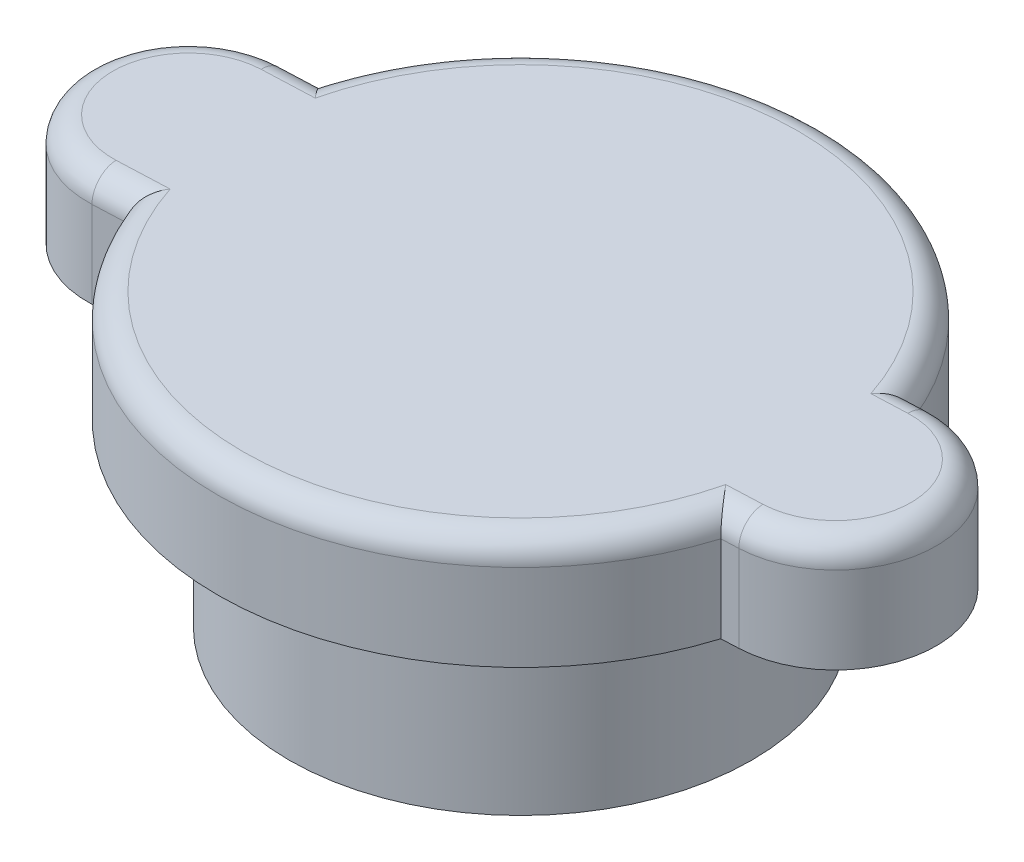
ISO-10303-21;
HEADER;
FILE_DESCRIPTION(('STEP AP214'),'2;1');
FILE_NAME('part.step','',(''),(''),'','','');
FILE_SCHEMA(('AUTOMOTIVE_DESIGN { 1 0 10303 214 1 1 1 1 }'));
ENDSEC;
DATA;
#1=APPLICATION_CONTEXT('core data for automotive mechanical design processes');
#2=APPLICATION_PROTOCOL_DEFINITION('international standard','automotive_design',2000,#1);
#3=PRODUCT_CONTEXT('',#1,'mechanical');
#4=PRODUCT('Part','Part','',(#3));
#5=PRODUCT_RELATED_PRODUCT_CATEGORY('part','',(#4));
#6=PRODUCT_DEFINITION_FORMATION('','',#4);
#7=PRODUCT_DEFINITION_CONTEXT('part definition',#1,'design');
#8=PRODUCT_DEFINITION('design','',#6,#7);
#9=PRODUCT_DEFINITION_SHAPE('','',#8);
#10=(LENGTH_UNIT() NAMED_UNIT(*) SI_UNIT(.MILLI.,.METRE.));
#11=(NAMED_UNIT(*) PLANE_ANGLE_UNIT() SI_UNIT($,.RADIAN.));
#12=(NAMED_UNIT(*) SI_UNIT($,.STERADIAN.) SOLID_ANGLE_UNIT());
#13=UNCERTAINTY_MEASURE_WITH_UNIT(LENGTH_MEASURE(1.E-05),#10,'distance_accuracy_value','');
#14=(GEOMETRIC_REPRESENTATION_CONTEXT(3) GLOBAL_UNCERTAINTY_ASSIGNED_CONTEXT((#13)) GLOBAL_UNIT_ASSIGNED_CONTEXT((#10,
#11,#12)) REPRESENTATION_CONTEXT('',''));
#15=CARTESIAN_POINT('',(0.,0.,0.));
#16=DIRECTION('',(0.,0.,1.));
#17=DIRECTION('',(1.,0.,0.));
#18=AXIS2_PLACEMENT_3D('',#15,#16,#17);
#19=CARTESIAN_POINT('',(0.,14.224,0.));
#20=DIRECTION('',(0.,-1.,0.));
#21=DIRECTION('',(0.,0.,-1.));
#22=AXIS2_PLACEMENT_3D('',#19,#20,#21);
#23=CYLINDRICAL_SURFACE('',#22,18.415);
#24=CARTESIAN_POINT('',(0.,14.224,0.));
#25=DIRECTION('',(0.,1.,0.));
#26=DIRECTION('',(0.,0.,1.));
#27=AXIS2_PLACEMENT_3D('',#24,#25,#26);
#28=CIRCLE('',#27,18.415);
#29=CARTESIAN_POINT('',(0.,14.224,18.415));
#30=VERTEX_POINT('',#29);
#31=EDGE_CURVE('E219',#30,#30,#28,.T.);
#32=ORIENTED_EDGE('',*,*,#31,.F.);
#33=EDGE_LOOP('',(#32));
#34=FACE_BOUND('',#33,.T.);
#35=CARTESIAN_POINT('',(0.,0.,0.));
#36=DIRECTION('',(0.,1.,0.));
#37=DIRECTION('',(0.,0.,1.));
#38=AXIS2_PLACEMENT_3D('',#35,#36,#37);
#39=CIRCLE('',#38,18.415);
#40=CARTESIAN_POINT('',(0.,0.,18.415));
#41=VERTEX_POINT('',#40);
#42=EDGE_CURVE('E163',#41,#41,#39,.T.);
#43=ORIENTED_EDGE('',*,*,#42,.T.);
#44=EDGE_LOOP('',(#43));
#45=FACE_BOUND('',#44,.T.);
#46=ADVANCED_FACE('F60',(#34,#45),#23,.T.);
#47=CARTESIAN_POINT('',(0.,0.,0.));
#48=DIRECTION('',(0.,1.,0.));
#49=DIRECTION('',(0.,0.,1.));
#50=AXIS2_PLACEMENT_3D('',#47,#48,#49);
#51=PLANE('',#50);
#52=ORIENTED_EDGE('',*,*,#42,.F.);
#53=EDGE_LOOP('',(#52));
#54=FACE_BOUND('',#53,.T.);
#55=ADVANCED_FACE('F393',(#54),#51,.F.);
#56=CARTESIAN_POINT('',(0.,23.114,0.));
#57=DIRECTION('',(0.,-1.,0.));
#58=DIRECTION('',(0.,0.,-1.));
#59=AXIS2_PLACEMENT_3D('',#56,#57,#58);
#60=CYLINDRICAL_SURFACE('',#59,24.0985030733377);
#61=DIRECTION('',(0.,-1.,0.));
#62=VECTOR('',#61,1.);
#63=CARTESIAN_POINT('',(-23.0324921981435,23.114,-7.08816996961317));
#64=LINE('',#63,#62);
#65=CARTESIAN_POINT('',(-23.0324921981435,14.224,-7.08816996961317));
#66=VERTEX_POINT('',#65);
#67=CARTESIAN_POINT('',(-23.0324921981435,21.114,-7.08816996961317));
#68=VERTEX_POINT('',#67);
#69=EDGE_CURVE('E189',#66,#68,#64,.F.);
#70=ORIENTED_EDGE('',*,*,#69,.T.);
#71=CARTESIAN_POINT('',(0.,21.114,0.));
#72=DIRECTION('',(0.,1.,0.));
#73=DIRECTION('',(0.,0.,1.));
#74=AXIS2_PLACEMENT_3D('',#71,#72,#73);
#75=CIRCLE('',#74,24.0985030733377);
#76=CARTESIAN_POINT('',(22.3744741533916,21.114,-8.95101987121461));
#77=VERTEX_POINT('',#76);
#78=EDGE_CURVE('E12',#68,#77,#75,.F.);
#79=ORIENTED_EDGE('',*,*,#78,.T.);
#80=DIRECTION('',(0.,-1.,0.));
#81=VECTOR('',#80,1.);
#82=CARTESIAN_POINT('',(22.3744741533916,23.114,-8.95101987121461));
#83=LINE('',#82,#81);
#84=CARTESIAN_POINT('',(22.3744741533916,14.224,-8.95101987121461));
#85=VERTEX_POINT('',#84);
#86=EDGE_CURVE('E214',#77,#85,#83,.T.);
#87=ORIENTED_EDGE('',*,*,#86,.T.);
#88=CARTESIAN_POINT('',(0.,14.224,0.));
#89=DIRECTION('',(0.,1.,0.));
#90=DIRECTION('',(0.,0.,1.));
#91=AXIS2_PLACEMENT_3D('',#88,#89,#90);
#92=CIRCLE('',#91,24.0985030733377);
#93=EDGE_CURVE('E183',#85,#66,#92,.T.);
#94=ORIENTED_EDGE('',*,*,#93,.T.);
#95=EDGE_LOOP('',(#70,#79,#87,#94));
#96=FACE_BOUND('',#95,.T.);
#97=ADVANCED_FACE('F369',(#96),#60,.T.);
#98=CARTESIAN_POINT('',(0.,14.224,0.));
#99=DIRECTION('',(0.,1.,0.));
#100=DIRECTION('',(0.,0.,1.));
#101=AXIS2_PLACEMENT_3D('',#98,#99,#100);
#102=PLANE('',#101);
#103=ORIENTED_EDGE('',*,*,#31,.T.);
#104=EDGE_LOOP('',(#103));
#105=FACE_BOUND('',#104,.T.);
#106=ORIENTED_EDGE('',*,*,#93,.F.);
#107=DIRECTION('',(0.999159509215093,0.,-0.0409911593524141));
#108=VECTOR('',#107,1.);
#109=CARTESIAN_POINT('',(-25.7076605564393,14.224,-6.97841947286257));
#110=LINE('',#109,#108);
#111=CARTESIAN_POINT('',(23.7492394811986,14.224,-9.00742050004771));
#112=VERTEX_POINT('',#111);
#113=EDGE_CURVE('E199',#85,#112,#110,.T.);
#114=ORIENTED_EDGE('',*,*,#113,.T.);
#115=CARTESIAN_POINT('',(24.0782485035745,14.224,-0.987825579633825));
#116=DIRECTION('',(0.,1.,0.));
#117=DIRECTION('',(0.,0.,1.));
#118=AXIS2_PLACEMENT_3D('',#115,#116,#117);
#119=CIRCLE('',#118,8.02634098604919);
#120=CARTESIAN_POINT('',(24.4072575259505,14.224,7.03176934078006));
#121=VERTEX_POINT('',#120);
#122=EDGE_CURVE('E174',#121,#112,#119,.T.);
#123=ORIENTED_EDGE('',*,*,#122,.F.);
#124=DIRECTION('',(0.999159509215093,0.,-0.0409911593524139));
#125=VECTOR('',#124,1.);
#126=CARTESIAN_POINT('',(-25.0496425116874,14.224,9.0607703679652));
#127=LINE('',#126,#125);
#128=CARTESIAN_POINT('',(23.0324921981435,14.224,7.08816996961317));
#129=VERTEX_POINT('',#128);
#130=EDGE_CURVE('E155',#129,#121,#127,.T.);
#131=ORIENTED_EDGE('',*,*,#130,.F.);
#132=CARTESIAN_POINT('',(-22.3744741533916,14.224,8.95101987121461));
#133=VERTEX_POINT('',#132);
#134=EDGE_CURVE('E171',#133,#129,#92,.T.);
#135=ORIENTED_EDGE('',*,*,#134,.F.);
#136=CARTESIAN_POINT('',(-25.0496425116874,14.224,9.0607703679652));
#137=VERTEX_POINT('',#136);
#138=EDGE_CURVE('E176',#137,#133,#127,.T.);
#139=ORIENTED_EDGE('',*,*,#138,.F.);
#140=CARTESIAN_POINT('',(-25.3786515340634,14.224,1.04117544755132));
#141=DIRECTION('',(0.,1.,0.));
#142=DIRECTION('',(0.,0.,1.));
#143=AXIS2_PLACEMENT_3D('',#140,#141,#142);
#144=CIRCLE('',#143,8.02634098604918);
#145=CARTESIAN_POINT('',(-25.7076605564393,14.224,-6.97841947286257));
#146=VERTEX_POINT('',#145);
#147=EDGE_CURVE('E177',#146,#137,#144,.T.);
#148=ORIENTED_EDGE('',*,*,#147,.F.);
#149=EDGE_CURVE('E200',#146,#66,#110,.T.);
#150=ORIENTED_EDGE('',*,*,#149,.T.);
#151=EDGE_LOOP('',(#106,#114,#123,#131,#135,#139,#148,#150));
#152=FACE_BOUND('',#151,.T.);
#153=ADVANCED_FACE('F169',(#105,#152),#102,.F.);
#154=CARTESIAN_POINT('',(0.,23.114,0.));
#155=DIRECTION('',(0.,1.,0.));
#156=DIRECTION('',(0.,0.,1.));
#157=AXIS2_PLACEMENT_3D('',#154,#155,#156);
#158=PLANE('',#157);
#159=CARTESIAN_POINT('',(24.0782485035745,23.114,-0.987825579633825));
#160=DIRECTION('',(0.,1.,0.));
#161=DIRECTION('',(0.,0.,1.));
#162=AXIS2_PLACEMENT_3D('',#159,#160,#161);
#163=CIRCLE('',#162,6.02634098604919);
#164=CARTESIAN_POINT('',(24.3252752072456,23.114,5.03345032234988));
#165=VERTEX_POINT('',#164);
#166=CARTESIAN_POINT('',(23.8312217999034,23.114,-7.00910148161753));
#167=VERTEX_POINT('',#166);
#168=EDGE_CURVE('E248',#165,#167,#163,.T.);
#169=ORIENTED_EDGE('',*,*,#168,.T.);
#170=DIRECTION('',(0.999159509215093,0.,-0.0409911593524141));
#171=VECTOR('',#170,1.);
#172=CARTESIAN_POINT('',(-0.247026703671126,23.114,-6.0212759019837));
#173=LINE('',#172,#171);
#174=CARTESIAN_POINT('',(20.9960315173369,23.114,-6.89278598284556));
#175=VERTEX_POINT('',#174);
#176=EDGE_CURVE('E251',#167,#175,#173,.F.);
#177=ORIENTED_EDGE('',*,*,#176,.T.);
#178=CARTESIAN_POINT('',(0.,23.114,0.));
#179=DIRECTION('',(0.,1.,0.));
#180=DIRECTION('',(0.,0.,1.));
#181=AXIS2_PLACEMENT_3D('',#178,#179,#180);
#182=CIRCLE('',#181,22.0985030733377);
#183=CARTESIAN_POINT('',(-21.4900849246791,23.114,-5.14976582112183));
#184=VERTEX_POINT('',#183);
#185=EDGE_CURVE('E230',#175,#184,#182,.T.);
#186=ORIENTED_EDGE('',*,*,#185,.T.);
#187=DIRECTION('',(0.999159509215093,0.,-0.0409911593524141));
#188=VECTOR('',#187,1.);
#189=CARTESIAN_POINT('',(-0.247026703671126,23.114,-6.0212759019837));
#190=LINE('',#189,#188);
#191=CARTESIAN_POINT('',(-25.6256782377345,23.114,-4.98010045443238));
#192=VERTEX_POINT('',#191);
#193=EDGE_CURVE('E233',#184,#192,#190,.F.);
#194=ORIENTED_EDGE('',*,*,#193,.T.);
#195=CARTESIAN_POINT('',(-25.3786515340634,23.114,1.04117544755132));
#196=DIRECTION('',(0.,1.,0.));
#197=DIRECTION('',(0.,0.,1.));
#198=AXIS2_PLACEMENT_3D('',#195,#196,#197);
#199=CIRCLE('',#198,6.02634098604918);
#200=CARTESIAN_POINT('',(-25.1316248303922,23.114,7.06245134953502));
#201=VERTEX_POINT('',#200);
#202=EDGE_CURVE('E236',#192,#201,#199,.T.);
#203=ORIENTED_EDGE('',*,*,#202,.T.);
#204=DIRECTION('',(0.999159509215093,0.,-0.0409911593524139));
#205=VECTOR('',#204,1.);
#206=CARTESIAN_POINT('',(-22.4564564720964,23.114,6.95270085278442));
#207=LINE('',#206,#205);
#208=CARTESIAN_POINT('',(-20.9960315173369,23.114,6.89278598284557));
#209=VERTEX_POINT('',#208);
#210=EDGE_CURVE('E239',#201,#209,#207,.T.);
#211=ORIENTED_EDGE('',*,*,#210,.T.);
#212=CARTESIAN_POINT('',(0.,23.114,0.));
#213=DIRECTION('',(0.,1.,0.));
#214=DIRECTION('',(0.,0.,1.));
#215=AXIS2_PLACEMENT_3D('',#212,#213,#214);
#216=CIRCLE('',#215,22.0985030733377);
#217=CARTESIAN_POINT('',(21.4900849246791,23.114,5.14976582112183));
#218=VERTEX_POINT('',#217);
#219=EDGE_CURVE('E242',#209,#218,#216,.T.);
#220=ORIENTED_EDGE('',*,*,#219,.T.);
#221=DIRECTION('',(0.999159509215093,0.,-0.0409911593524139));
#222=VECTOR('',#221,1.);
#223=CARTESIAN_POINT('',(24.3252752072456,23.114,5.03345032234988));
#224=LINE('',#223,#222);
#225=EDGE_CURVE('E245',#218,#165,#224,.T.);
#226=ORIENTED_EDGE('',*,*,#225,.T.);
#227=EDGE_LOOP('',(#169,#177,#186,#194,#203,#211,#220,#226));
#228=FACE_BOUND('',#227,.T.);
#229=ADVANCED_FACE('F349',(#228),#158,.T.);
#230=DIRECTION('',(0.,-1.,0.));
#231=VECTOR('',#230,1.);
#232=CARTESIAN_POINT('',(23.0324921981435,23.114,7.08816996961317));
#233=LINE('',#232,#231);
#234=CARTESIAN_POINT('',(23.0324921981435,21.114,7.08816996961317));
#235=VERTEX_POINT('',#234);
#236=EDGE_CURVE('E151',#235,#129,#233,.T.);
#237=ORIENTED_EDGE('',*,*,#236,.F.);
#238=CARTESIAN_POINT('',(0.,21.114,0.));
#239=DIRECTION('',(0.,1.,0.));
#240=DIRECTION('',(0.,0.,1.));
#241=AXIS2_PLACEMENT_3D('',#238,#239,#240);
#242=CIRCLE('',#241,24.0985030733377);
#243=CARTESIAN_POINT('',(-22.3744741533916,21.114,8.9510198712146));
#244=VERTEX_POINT('',#243);
#245=EDGE_CURVE('E260',#235,#244,#242,.F.);
#246=ORIENTED_EDGE('',*,*,#245,.T.);
#247=DIRECTION('',(0.,-1.,0.));
#248=VECTOR('',#247,1.);
#249=CARTESIAN_POINT('',(-22.3744741533916,23.114,8.9510198712146));
#250=LINE('',#249,#248);
#251=EDGE_CURVE('E164',#133,#244,#250,.F.);
#252=ORIENTED_EDGE('',*,*,#251,.F.);
#253=ORIENTED_EDGE('',*,*,#134,.T.);
#254=EDGE_LOOP('',(#237,#246,#252,#253));
#255=FACE_BOUND('',#254,.T.);
#256=ADVANCED_FACE('F179',(#255),#60,.T.);
#257=CARTESIAN_POINT('',(-25.3786515340634,23.114,1.04117544755132));
#258=DIRECTION('',(0.,-1.,0.));
#259=DIRECTION('',(0.,0.,-1.));
#260=AXIS2_PLACEMENT_3D('',#257,#258,#259);
#261=CYLINDRICAL_SURFACE('',#260,8.02634098604918);
#262=DIRECTION('',(0.,-1.,0.));
#263=VECTOR('',#262,1.);
#264=CARTESIAN_POINT('',(-25.0496425116874,23.114,9.0607703679652));
#265=LINE('',#264,#263);
#266=CARTESIAN_POINT('',(-25.0496425116874,21.114,9.0607703679652));
#267=VERTEX_POINT('',#266);
#268=EDGE_CURVE('E184',#267,#137,#265,.T.);
#269=ORIENTED_EDGE('',*,*,#268,.F.);
#270=CARTESIAN_POINT('',(-25.3786515340634,21.114,1.04117544755132));
#271=DIRECTION('',(0.,1.,0.));
#272=DIRECTION('',(0.,0.,1.));
#273=AXIS2_PLACEMENT_3D('',#270,#271,#272);
#274=CIRCLE('',#273,8.02634098604918);
#275=CARTESIAN_POINT('',(-25.7076605564393,21.114,-6.97841947286257));
#276=VERTEX_POINT('',#275);
#277=EDGE_CURVE('E85',#267,#276,#274,.F.);
#278=ORIENTED_EDGE('',*,*,#277,.T.);
#279=DIRECTION('',(0.,-1.,0.));
#280=VECTOR('',#279,1.);
#281=CARTESIAN_POINT('',(-25.7076605564393,23.114,-6.97841947286257));
#282=LINE('',#281,#280);
#283=EDGE_CURVE('E204',#276,#146,#282,.T.);
#284=ORIENTED_EDGE('',*,*,#283,.T.);
#285=ORIENTED_EDGE('',*,*,#147,.T.);
#286=EDGE_LOOP('',(#269,#278,#284,#285));
#287=FACE_BOUND('',#286,.T.);
#288=ADVANCED_FACE('F378',(#287),#261,.T.);
#289=CARTESIAN_POINT('',(-25.0496425116874,23.114,9.0607703679652));
#290=DIRECTION('',(-0.0409911593524139,0.,-0.999159509215093));
#291=DIRECTION('',(-0.999159509215093,0.,0.0409911593524139));
#292=AXIS2_PLACEMENT_3D('',#289,#290,#291);
#293=PLANE('',#292);
#294=ORIENTED_EDGE('',*,*,#251,.T.);
#295=DIRECTION('',(0.999159509215093,0.,-0.0409911593524139));
#296=VECTOR('',#295,1.);
#297=CARTESIAN_POINT('',(-25.0496425116874,21.114,9.0607703679652));
#298=LINE('',#297,#296);
#299=EDGE_CURVE('E263',#244,#267,#298,.F.);
#300=ORIENTED_EDGE('',*,*,#299,.T.);
#301=ORIENTED_EDGE('',*,*,#268,.T.);
#302=ORIENTED_EDGE('',*,*,#138,.T.);
#303=EDGE_LOOP('',(#294,#300,#301,#302));
#304=FACE_BOUND('',#303,.T.);
#305=ADVANCED_FACE('F380',(#304),#293,.F.);
#306=CARTESIAN_POINT('',(-25.7076605564393,23.114,-6.97841947286257));
#307=DIRECTION('',(-0.0409911593524141,0.,-0.999159509215093));
#308=DIRECTION('',(-0.999159509215093,0.,0.0409911593524141));
#309=AXIS2_PLACEMENT_3D('',#306,#307,#308);
#310=PLANE('',#309);
#311=ORIENTED_EDGE('',*,*,#283,.F.);
#312=DIRECTION('',(0.999159509215093,0.,-0.0409911593524141));
#313=VECTOR('',#312,1.);
#314=CARTESIAN_POINT('',(-25.7076605564393,21.114,-6.97841947286257));
#315=LINE('',#314,#313);
#316=EDGE_CURVE('E70',#276,#68,#315,.T.);
#317=ORIENTED_EDGE('',*,*,#316,.T.);
#318=ORIENTED_EDGE('',*,*,#69,.F.);
#319=ORIENTED_EDGE('',*,*,#149,.F.);
#320=EDGE_LOOP('',(#311,#317,#318,#319));
#321=FACE_BOUND('',#320,.T.);
#322=ADVANCED_FACE('F377',(#321),#310,.T.);
#323=CARTESIAN_POINT('',(24.0782485035745,23.114,-0.987825579633825));
#324=DIRECTION('',(0.,-1.,0.));
#325=DIRECTION('',(0.,0.,-1.));
#326=AXIS2_PLACEMENT_3D('',#323,#324,#325);
#327=CYLINDRICAL_SURFACE('',#326,8.02634098604919);
#328=DIRECTION('',(0.,-1.,0.));
#329=VECTOR('',#328,1.);
#330=CARTESIAN_POINT('',(23.7492394811986,23.114,-9.00742050004771));
#331=LINE('',#330,#329);
#332=CARTESIAN_POINT('',(23.7492394811986,21.114,-9.00742050004771));
#333=VERTEX_POINT('',#332);
#334=EDGE_CURVE('E207',#333,#112,#331,.T.);
#335=ORIENTED_EDGE('',*,*,#334,.F.);
#336=CARTESIAN_POINT('',(24.0782485035745,21.114,-0.987825579633825));
#337=DIRECTION('',(0.,1.,0.));
#338=DIRECTION('',(0.,0.,1.));
#339=AXIS2_PLACEMENT_3D('',#336,#337,#338);
#340=CIRCLE('',#339,8.02634098604919);
#341=CARTESIAN_POINT('',(24.4072575259505,21.114,7.03176934078006));
#342=VERTEX_POINT('',#341);
#343=EDGE_CURVE('E255',#333,#342,#340,.F.);
#344=ORIENTED_EDGE('',*,*,#343,.T.);
#345=DIRECTION('',(0.,-1.,0.));
#346=VECTOR('',#345,1.);
#347=CARTESIAN_POINT('',(24.4072575259505,23.114,7.03176934078006));
#348=LINE('',#347,#346);
#349=EDGE_CURVE('E190',#342,#121,#348,.T.);
#350=ORIENTED_EDGE('',*,*,#349,.T.);
#351=ORIENTED_EDGE('',*,*,#122,.T.);
#352=EDGE_LOOP('',(#335,#344,#350,#351));
#353=FACE_BOUND('',#352,.T.);
#354=ADVANCED_FACE('F387',(#353),#327,.T.);
#355=ORIENTED_EDGE('',*,*,#86,.F.);
#356=DIRECTION('',(0.999159509215093,0.,-0.0409911593524141));
#357=VECTOR('',#356,1.);
#358=CARTESIAN_POINT('',(-25.7076605564393,21.114,-6.97841947286257));
#359=LINE('',#358,#357);
#360=EDGE_CURVE('E223',#77,#333,#359,.T.);
#361=ORIENTED_EDGE('',*,*,#360,.T.);
#362=ORIENTED_EDGE('',*,*,#334,.T.);
#363=ORIENTED_EDGE('',*,*,#113,.F.);
#364=EDGE_LOOP('',(#355,#361,#362,#363));
#365=FACE_BOUND('',#364,.T.);
#366=ADVANCED_FACE('F372',(#365),#310,.T.);
#367=ORIENTED_EDGE('',*,*,#349,.F.);
#368=DIRECTION('',(0.999159509215093,0.,-0.0409911593524139));
#369=VECTOR('',#368,1.);
#370=CARTESIAN_POINT('',(23.0324921981435,21.114,7.08816996961317));
#371=LINE('',#370,#369);
#372=EDGE_CURVE('E158',#342,#235,#371,.F.);
#373=ORIENTED_EDGE('',*,*,#372,.T.);
#374=ORIENTED_EDGE('',*,*,#236,.T.);
#375=ORIENTED_EDGE('',*,*,#130,.T.);
#376=EDGE_LOOP('',(#367,#373,#374,#375));
#377=FACE_BOUND('',#376,.T.);
#378=ADVANCED_FACE('F154',(#377),#293,.F.);
#379=CARTESIAN_POINT('',(0.247026703671125,21.114,6.0212759019837));
#380=DIRECTION('',(-0.999159509215093,0.,0.0409911593524139));
#381=DIRECTION('',(0.0409911593524139,0.,0.999159509215093));
#382=AXIS2_PLACEMENT_3D('',#379,#380,#381);
#383=CYLINDRICAL_SURFACE('',#382,2.);
#384=CARTESIAN_POINT('',(-22.3744741533916,21.114,8.9510198712146));
#385=CARTESIAN_POINT('',(-22.3744800494696,21.1628408454334,8.95102963175667));
#386=CARTESIAN_POINT('',(-22.3732832793538,21.2116759167955,8.94918071582054));
#387=CARTESIAN_POINT('',(-22.3685296946854,21.3089352940315,8.94184025911029));
#388=CARTESIAN_POINT('',(-22.3649739031695,21.3573597687532,8.93635029734858));
#389=CARTESIAN_POINT('',(-22.3555725108031,21.453186707887,8.92184097065932));
#390=CARTESIAN_POINT('',(-22.3497391651781,21.500593232937,8.91284049561353));
#391=CARTESIAN_POINT('',(-22.3358699294122,21.594296474588,8.89145380908013));
#392=CARTESIAN_POINT('',(-22.3278338994087,21.6405931205127,8.87906738259684));
#393=CARTESIAN_POINT('',(-22.3005954481301,21.7772160488451,8.83711374759362));
#394=CARTESIAN_POINT('',(-22.2782406003702,21.8654944392747,8.80271803409889));
#395=CARTESIAN_POINT('',(-22.2261679454461,22.0344980658561,8.72277281807686));
#396=CARTESIAN_POINT('',(-22.1964418051814,22.1152146102174,8.67721069282634));
#397=CARTESIAN_POINT('',(-22.1286701019366,22.272726914948,8.5736106317911));
#398=CARTESIAN_POINT('',(-22.0902140137348,22.3489416337043,8.51496110142272));
#399=CARTESIAN_POINT('',(-22.0075941508942,22.4906087032483,8.38936836131895));
#400=CARTESIAN_POINT('',(-21.9634289156002,22.5560582900622,8.32242302932844));
#401=CARTESIAN_POINT('',(-21.8624846164585,22.6863504787235,8.16996577244482));
#402=CARTESIAN_POINT('',(-21.8048469195891,22.7491142133867,8.08324842500092));
#403=CARTESIAN_POINT('',(-21.6848887855517,22.8595334133368,7.90360658515537));
#404=CARTESIAN_POINT('',(-21.6225633181905,22.9071723544872,7.81067543727673));
#405=CARTESIAN_POINT('',(-21.4822555419873,22.9953359842754,7.60249916699999));
#406=CARTESIAN_POINT('',(-21.4035691282731,23.0327249766788,7.48640275102905));
#407=CARTESIAN_POINT('',(-21.2434375408175,23.086903903736,7.25160021539578));
#408=CARTESIAN_POINT('',(-21.1619963468125,23.1037223508608,7.13289794066713));
#409=CARTESIAN_POINT('',(-21.0538026300723,23.1127013114173,6.97619711423227));
#410=CARTESIAN_POINT('',(-21.0275339674882,23.1138528062817,6.93822775785211));
#411=CARTESIAN_POINT('',(-20.9994954396395,23.1139955888305,6.89778175064003));
#412=CARTESIAN_POINT('',(-20.9977635587264,23.1139999981211,6.89528381690682));
#413=CARTESIAN_POINT('',(-20.9960315173369,23.114,6.89278598284556));
#414=B_SPLINE_CURVE_WITH_KNOTS('',3,(#384,#385,#386,#387,#388,#389,#390,#391,#392,#393,#394,
#395,#396,#397,#398,#399,#400,#401,#402,#403,#404,#405,#406,#407,#408,#409,#410,#411,#412,#413),
.UNSPECIFIED.,.F.,.F.,(4,2,2,2,2,2,2,2,2,2,2,2,2,2,4),(0.,0.146463334685826,0.292863194111355,
0.438485916937579,0.584117888428689,0.874721894272272,1.16565593197721,1.47519946759629,
1.78482235562181,2.14820961694034,2.51199253066936,2.9458162608141,3.37903799157044,
3.51756275870741,3.52668151843988),.UNSPECIFIED.);
#415=EDGE_CURVE('E328',#209,#244,#414,.F.);
#416=ORIENTED_EDGE('',*,*,#415,.F.);
#417=ORIENTED_EDGE('',*,*,#210,.F.);
#418=CARTESIAN_POINT('',(-25.1316248303922,21.114,7.06245134953502));
#419=DIRECTION('',(-0.999159509215093,0.,0.0409911593524139));
#420=DIRECTION('',(0.0409911593524139,0.,0.999159509215093));
#421=AXIS2_PLACEMENT_3D('',#418,#419,#420);
#422=CIRCLE('',#421,2.);
#423=EDGE_CURVE('E64',#267,#201,#422,.T.);
#424=ORIENTED_EDGE('',*,*,#423,.F.);
#425=ORIENTED_EDGE('',*,*,#299,.F.);
#426=EDGE_LOOP('',(#416,#417,#424,#425));
#427=FACE_BOUND('',#426,.T.);
#428=ADVANCED_FACE('F325',(#427),#383,.T.);
#429=CARTESIAN_POINT('',(-25.3786515340634,21.114,1.04117544755132));
#430=DIRECTION('',(0.,1.,0.));
#431=DIRECTION('',(0.,0.,1.));
#432=AXIS2_PLACEMENT_3D('',#429,#430,#431);
#433=TOROIDAL_SURFACE('',#432,6.02634098604918,2.);
#434=ORIENTED_EDGE('',*,*,#423,.T.);
#435=ORIENTED_EDGE('',*,*,#202,.F.);
#436=CARTESIAN_POINT('',(-25.6256782377345,21.114,-4.98010045443238));
#437=DIRECTION('',(0.999159509215093,0.,-0.0409911593524139));
#438=DIRECTION('',(-0.0409911593524139,0.,-0.999159509215093));
#439=AXIS2_PLACEMENT_3D('',#436,#437,#438);
#440=CIRCLE('',#439,2.);
#441=EDGE_CURVE('E321',#276,#192,#440,.T.);
#442=ORIENTED_EDGE('',*,*,#441,.F.);
#443=ORIENTED_EDGE('',*,*,#277,.F.);
#444=EDGE_LOOP('',(#434,#435,#442,#443));
#445=FACE_BOUND('',#444,.T.);
#446=ADVANCED_FACE('F62',(#445),#433,.T.);
#447=CARTESIAN_POINT('',(0.,21.114,0.));
#448=DIRECTION('',(0.,1.,0.));
#449=DIRECTION('',(0.,0.,1.));
#450=AXIS2_PLACEMENT_3D('',#447,#448,#449);
#451=TOROIDAL_SURFACE('',#450,22.0985030733377,2.);
#452=ORIENTED_EDGE('',*,*,#415,.T.);
#453=ORIENTED_EDGE('',*,*,#245,.F.);
#454=CARTESIAN_POINT('',(23.0324921981435,21.114,7.08816996961317));
#455=CARTESIAN_POINT('',(23.0324988739268,21.1628408454334,7.08817921438657));
#456=CARTESIAN_POINT('',(23.0311546746018,21.2116759167955,7.08643454335057));
#457=CARTESIAN_POINT('',(23.0258157827293,21.3089352940315,7.07950813695995));
#458=CARTESIAN_POINT('',(23.0218222391227,21.3573597687532,7.07432789151096));
#459=CARTESIAN_POINT('',(23.011263932134,21.453186707887,7.06063742428242));
#460=CARTESIAN_POINT('',(23.0047129301279,21.500593232937,7.05214502503688));
#461=CARTESIAN_POINT('',(22.9891384461327,21.594296474588,7.03196628598085));
#462=CARTESIAN_POINT('',(22.9801148071401,21.6405931205127,7.02027974335382));
#463=CARTESIAN_POINT('',(22.9495313266024,21.7772160488451,6.9806982901687));
#464=CARTESIAN_POINT('',(22.9244341331367,21.8654944392747,6.94824932708323));
#465=CARTESIAN_POINT('',(22.8659878854651,22.0344980658561,6.87283821988563));
#466=CARTESIAN_POINT('',(22.8326294921922,22.1152146102174,6.8298641780623));
#467=CARTESIAN_POINT('',(22.7565993045447,22.272726914948,6.73216368178161));
#468=CARTESIAN_POINT('',(22.7134682667391,22.3489416337044,6.67686131555712));
#469=CARTESIAN_POINT('',(22.6208383220722,22.4906087032483,6.55845831114597));
#470=CARTESIAN_POINT('',(22.5713377856232,22.5560582900622,6.49535567748338));
#471=CARTESIAN_POINT('',(22.4582444205784,22.6863504787235,6.35167945297665));
#472=CARTESIAN_POINT('',(22.3936971041646,22.7491142133867,6.26997482402641));
#473=CARTESIAN_POINT('',(22.2594270191923,22.8595334133368,6.10076285983254));
#474=CARTESIAN_POINT('',(22.1896986921718,22.9071723544872,6.01324930351828));
#475=CARTESIAN_POINT('',(22.0328099984358,22.9953359842754,5.81726570893136));
#476=CARTESIAN_POINT('',(21.9448781606654,23.0327249766788,5.70800491353415));
#477=CARTESIAN_POINT('',(21.7660512263122,23.086903903736,5.48710836853918));
#478=CARTESIAN_POINT('',(21.6751604110434,23.1037223508608,5.3754761249602));
#479=CARTESIAN_POINT('',(21.5544943851657,23.1127013114173,5.22816441617124));
#480=CARTESIAN_POINT('',(21.5252038001606,23.1138528062817,5.19247441353833));
#481=CARTESIAN_POINT('',(21.4939464266888,23.1139955888305,5.1544610586881));
#482=CARTESIAN_POINT('',(21.4920157515704,23.1139999981211,5.15211338366389));
#483=CARTESIAN_POINT('',(21.4900849246791,23.114,5.14976582112183));
#484=B_SPLINE_CURVE_WITH_KNOTS('',3,(#454,#455,#456,#457,#458,#459,#460,#461,#462,#463,#464,
#465,#466,#467,#468,#469,#470,#471,#472,#473,#474,#475,#476,#477,#478,#479,#480,#481,#482,#483),
.UNSPECIFIED.,.F.,.F.,(4,2,2,2,2,2,2,2,2,2,2,2,2,2,4),(0.,0.146463334685826,0.292863194111355,
0.438485916937578,0.584117888428689,0.874721894272272,1.16565593197721,1.47519946759629,
1.78482235562181,2.14820961694034,2.51199253066936,2.9458162608141,3.37903799157045,
3.51756275870741,3.52668151843988),.UNSPECIFIED.);
#485=EDGE_CURVE('E313',#218,#235,#484,.F.);
#486=ORIENTED_EDGE('',*,*,#485,.F.);
#487=ORIENTED_EDGE('',*,*,#219,.F.);
#488=EDGE_LOOP('',(#452,#453,#486,#487));
#489=FACE_BOUND('',#488,.T.);
#490=ADVANCED_FACE('F301',(#489),#451,.T.);
#491=CARTESIAN_POINT('',(-25.6256782377345,21.114,-4.98010045443238));
#492=DIRECTION('',(0.999159509215093,0.,-0.0409911593524141));
#493=DIRECTION('',(-0.0409911593524141,0.,-0.999159509215093));
#494=AXIS2_PLACEMENT_3D('',#491,#492,#493);
#495=CYLINDRICAL_SURFACE('',#494,2.);
#496=ORIENTED_EDGE('',*,*,#441,.T.);
#497=ORIENTED_EDGE('',*,*,#193,.F.);
#498=CARTESIAN_POINT('',(-23.0324921981435,21.114,-7.08816996961317));
#499=CARTESIAN_POINT('',(-23.0324988739268,21.1628408454334,-7.08817921438656));
#500=CARTESIAN_POINT('',(-23.0311546746018,21.2116759167955,-7.08643454335056));
#501=CARTESIAN_POINT('',(-23.0258157827293,21.3089352940315,-7.07950813695995));
#502=CARTESIAN_POINT('',(-23.0218222391227,21.3573597687532,-7.07432789151096));
#503=CARTESIAN_POINT('',(-23.011263932134,21.453186707887,-7.06063742428241));
#504=CARTESIAN_POINT('',(-23.0047129301279,21.500593232937,-7.05214502503687));
#505=CARTESIAN_POINT('',(-22.9891384461327,21.594296474588,-7.03196628598085));
#506=CARTESIAN_POINT('',(-22.9801148071401,21.6405931205127,-7.02027974335382));
#507=CARTESIAN_POINT('',(-22.9495313266024,21.7772160488451,-6.9806982901687));
#508=CARTESIAN_POINT('',(-22.9244341331367,21.8654944392747,-6.94824932708323));
#509=CARTESIAN_POINT('',(-22.8659878854651,22.0344980658561,-6.87283821988563));
#510=CARTESIAN_POINT('',(-22.8326294921922,22.1152146102174,-6.82986417806229));
#511=CARTESIAN_POINT('',(-22.7565993045447,22.272726914948,-6.73216368178161));
#512=CARTESIAN_POINT('',(-22.7134682667391,22.3489416337043,-6.67686131555712));
#513=CARTESIAN_POINT('',(-22.6208383220722,22.4906087032483,-6.55845831114597));
#514=CARTESIAN_POINT('',(-22.5713377856232,22.5560582900622,-6.49535567748338));
#515=CARTESIAN_POINT('',(-22.4582444205784,22.6863504787235,-6.35167945297665));
#516=CARTESIAN_POINT('',(-22.3936971041646,22.7491142133867,-6.26997482402641));
#517=CARTESIAN_POINT('',(-22.2594270191923,22.8595334133368,-6.10076285983254));
#518=CARTESIAN_POINT('',(-22.1896986921718,22.9071723544872,-6.01324930351828));
#519=CARTESIAN_POINT('',(-22.0328099984358,22.9953359842754,-5.81726570893136));
#520=CARTESIAN_POINT('',(-21.9448781606654,23.0327249766788,-5.70800491353415));
#521=CARTESIAN_POINT('',(-21.7660512263122,23.086903903736,-5.48710836853916));
#522=CARTESIAN_POINT('',(-21.6751604110434,23.1037223508608,-5.37547612496016));
#523=CARTESIAN_POINT('',(-21.5544943851657,23.1127013114173,-5.22816441617125));
#524=CARTESIAN_POINT('',(-21.5252038001606,23.1138528062817,-5.19247441353836));
#525=CARTESIAN_POINT('',(-21.4939464266889,23.1139955888305,-5.1544610586881));
#526=CARTESIAN_POINT('',(-21.4920157515704,23.1139999981211,-5.15211338366389));
#527=CARTESIAN_POINT('',(-21.4900849246791,23.114,-5.14976582112183));
#528=B_SPLINE_CURVE_WITH_KNOTS('',3,(#498,#499,#500,#501,#502,#503,#504,#505,#506,#507,#508,
#509,#510,#511,#512,#513,#514,#515,#516,#517,#518,#519,#520,#521,#522,#523,#524,#525,#526,#527),
.UNSPECIFIED.,.F.,.F.,(4,2,2,2,2,2,2,2,2,2,2,2,2,2,4),(0.,0.146463334685826,0.292863194111355,
0.438485916937575,0.584117888428688,0.874721894272272,1.16565593197721,1.47519946759629,
1.78482235562181,2.14820961694034,2.51199253066936,2.9458162608141,3.37903799157045,
3.5175627587074,3.52668151843987),.UNSPECIFIED.);
#529=EDGE_CURVE('E305',#68,#184,#528,.T.);
#530=ORIENTED_EDGE('',*,*,#529,.F.);
#531=ORIENTED_EDGE('',*,*,#316,.F.);
#532=EDGE_LOOP('',(#496,#497,#530,#531));
#533=FACE_BOUND('',#532,.T.);
#534=ADVANCED_FACE('F296',(#533),#495,.T.);
#535=CARTESIAN_POINT('',(0.247026703671125,21.114,6.0212759019837));
#536=DIRECTION('',(-0.999159509215093,0.,0.0409911593524139));
#537=DIRECTION('',(0.0409911593524139,0.,0.999159509215093));
#538=AXIS2_PLACEMENT_3D('',#535,#536,#537);
#539=CYLINDRICAL_SURFACE('',#538,2.);
#540=ORIENTED_EDGE('',*,*,#485,.T.);
#541=ORIENTED_EDGE('',*,*,#372,.F.);
#542=CARTESIAN_POINT('',(24.3252752072456,21.114,5.03345032234988));
#543=DIRECTION('',(0.999159509215093,0.,-0.0409911593524139));
#544=DIRECTION('',(-0.0409911593524139,0.,-0.999159509215093));
#545=AXIS2_PLACEMENT_3D('',#542,#543,#544);
#546=CIRCLE('',#545,2.);
#547=EDGE_CURVE('E282',#165,#342,#546,.T.);
#548=ORIENTED_EDGE('',*,*,#547,.F.);
#549=ORIENTED_EDGE('',*,*,#225,.F.);
#550=EDGE_LOOP('',(#540,#541,#548,#549));
#551=FACE_BOUND('',#550,.T.);
#552=ADVANCED_FACE('F300',(#551),#539,.T.);
#553=CARTESIAN_POINT('',(0.,21.114,0.));
#554=DIRECTION('',(0.,1.,0.));
#555=DIRECTION('',(0.,0.,1.));
#556=AXIS2_PLACEMENT_3D('',#553,#554,#555);
#557=TOROIDAL_SURFACE('',#556,22.0985030733377,2.);
#558=ORIENTED_EDGE('',*,*,#529,.T.);
#559=ORIENTED_EDGE('',*,*,#185,.F.);
#560=CARTESIAN_POINT('',(22.3744741533916,21.114,-8.95101987121461));
#561=CARTESIAN_POINT('',(22.3744800494696,21.1628408454334,-8.95102963175667));
#562=CARTESIAN_POINT('',(22.3732832793538,21.2116759167955,-8.94918071582054));
#563=CARTESIAN_POINT('',(22.3685296946854,21.3089352940315,-8.9418402591103));
#564=CARTESIAN_POINT('',(22.3649739031695,21.3573597687532,-8.93635029734859));
#565=CARTESIAN_POINT('',(22.3555725108031,21.453186707887,-8.92184097065932));
#566=CARTESIAN_POINT('',(22.3497391651781,21.500593232937,-8.91284049561353));
#567=CARTESIAN_POINT('',(22.3358699294122,21.594296474588,-8.89145380908013));
#568=CARTESIAN_POINT('',(22.3278338994087,21.6405931205127,-8.87906738259685));
#569=CARTESIAN_POINT('',(22.3005954481301,21.7772160488451,-8.83711374759362));
#570=CARTESIAN_POINT('',(22.2782406003702,21.8654944392747,-8.8027180340989));
#571=CARTESIAN_POINT('',(22.2261679454461,22.0344980658561,-8.72277281807686));
#572=CARTESIAN_POINT('',(22.1964418051814,22.1152146102174,-8.67721069282634));
#573=CARTESIAN_POINT('',(22.1286701019366,22.272726914948,-8.5736106317911));
#574=CARTESIAN_POINT('',(22.0902140137348,22.3489416337043,-8.51496110142272));
#575=CARTESIAN_POINT('',(22.0075941508942,22.4906087032483,-8.38936836131895));
#576=CARTESIAN_POINT('',(21.9634289156002,22.5560582900622,-8.32242302932844));
#577=CARTESIAN_POINT('',(21.8624846164585,22.6863504787235,-8.16996577244483));
#578=CARTESIAN_POINT('',(21.8048469195891,22.7491142133867,-8.08324842500092));
#579=CARTESIAN_POINT('',(21.6848887855518,22.8595334133368,-7.90360658515538));
#580=CARTESIAN_POINT('',(21.6225633181905,22.9071723544872,-7.81067543727674));
#581=CARTESIAN_POINT('',(21.4822555419873,22.9953359842754,-7.60249916699999));
#582=CARTESIAN_POINT('',(21.4035691282731,23.0327249766788,-7.48640275102904));
#583=CARTESIAN_POINT('',(21.2434375408175,23.086903903736,-7.25160021539579));
#584=CARTESIAN_POINT('',(21.1619963468125,23.1037223508608,-7.13289794066716));
#585=CARTESIAN_POINT('',(21.0538026300723,23.1127013114173,-6.97619711423226));
#586=CARTESIAN_POINT('',(21.0275339674882,23.1138528062817,-6.93822775785208));
#587=CARTESIAN_POINT('',(20.9994954396395,23.1139955888305,-6.89778175064002));
#588=CARTESIAN_POINT('',(20.9977635587264,23.1139999981211,-6.89528381690682));
#589=CARTESIAN_POINT('',(20.9960315173369,23.114,-6.89278598284556));
#590=B_SPLINE_CURVE_WITH_KNOTS('',3,(#560,#561,#562,#563,#564,#565,#566,#567,#568,#569,#570,
#571,#572,#573,#574,#575,#576,#577,#578,#579,#580,#581,#582,#583,#584,#585,#586,#587,#588,#589),
.UNSPECIFIED.,.F.,.F.,(4,2,2,2,2,2,2,2,2,2,2,2,2,2,4),(0.,0.146463334685826,0.292863194111352,
0.438485916937575,0.584117888428689,0.874721894272272,1.16565593197721,1.47519946759628,
1.7848223556218,2.14820961694033,2.51199253066936,2.9458162608141,3.37903799157044,
3.51756275870742,3.52668151843989),.UNSPECIFIED.);
#591=EDGE_CURVE('E273',#77,#175,#590,.T.);
#592=ORIENTED_EDGE('',*,*,#591,.F.);
#593=ORIENTED_EDGE('',*,*,#78,.F.);
#594=EDGE_LOOP('',(#558,#559,#592,#593));
#595=FACE_BOUND('',#594,.T.);
#596=ADVANCED_FACE('F284',(#595),#557,.T.);
#597=CARTESIAN_POINT('',(24.0782485035745,21.114,-0.987825579633825));
#598=DIRECTION('',(0.,1.,0.));
#599=DIRECTION('',(0.,0.,1.));
#600=AXIS2_PLACEMENT_3D('',#597,#598,#599);
#601=TOROIDAL_SURFACE('',#600,6.02634098604919,2.);
#602=ORIENTED_EDGE('',*,*,#547,.T.);
#603=ORIENTED_EDGE('',*,*,#343,.F.);
#604=CARTESIAN_POINT('',(23.8312217999034,21.114,-7.00910148161753));
#605=DIRECTION('',(-0.999159509215093,0.,0.0409911593524139));
#606=DIRECTION('',(0.0409911593524139,0.,0.999159509215093));
#607=AXIS2_PLACEMENT_3D('',#604,#605,#606);
#608=CIRCLE('',#607,2.);
#609=EDGE_CURVE('E270',#167,#333,#608,.T.);
#610=ORIENTED_EDGE('',*,*,#609,.F.);
#611=ORIENTED_EDGE('',*,*,#168,.F.);
#612=EDGE_LOOP('',(#602,#603,#610,#611));
#613=FACE_BOUND('',#612,.T.);
#614=ADVANCED_FACE('F291',(#613),#601,.T.);
#615=CARTESIAN_POINT('',(-25.6256782377345,21.114,-4.98010045443238));
#616=DIRECTION('',(0.999159509215093,0.,-0.0409911593524141));
#617=DIRECTION('',(-0.0409911593524141,0.,-0.999159509215093));
#618=AXIS2_PLACEMENT_3D('',#615,#616,#617);
#619=CYLINDRICAL_SURFACE('',#618,2.);
#620=ORIENTED_EDGE('',*,*,#591,.T.);
#621=ORIENTED_EDGE('',*,*,#176,.F.);
#622=ORIENTED_EDGE('',*,*,#609,.T.);
#623=ORIENTED_EDGE('',*,*,#360,.F.);
#624=EDGE_LOOP('',(#620,#621,#622,#623));
#625=FACE_BOUND('',#624,.T.);
#626=ADVANCED_FACE('F287',(#625),#619,.T.);
#627=CLOSED_SHELL('',(#46,#55,#97,#153,#229,#256,#288,#305,#322,#354,#366,#378,#428,#446,#490,
#534,#552,#596,#614,#626));
#628=MANIFOLD_SOLID_BREP('B2',#627);
#629=ADVANCED_BREP_SHAPE_REPRESENTATION('',(#18,#628),#14);
#630=SHAPE_DEFINITION_REPRESENTATION(#9,#629);
ENDSEC;
END-ISO-10303-21;
